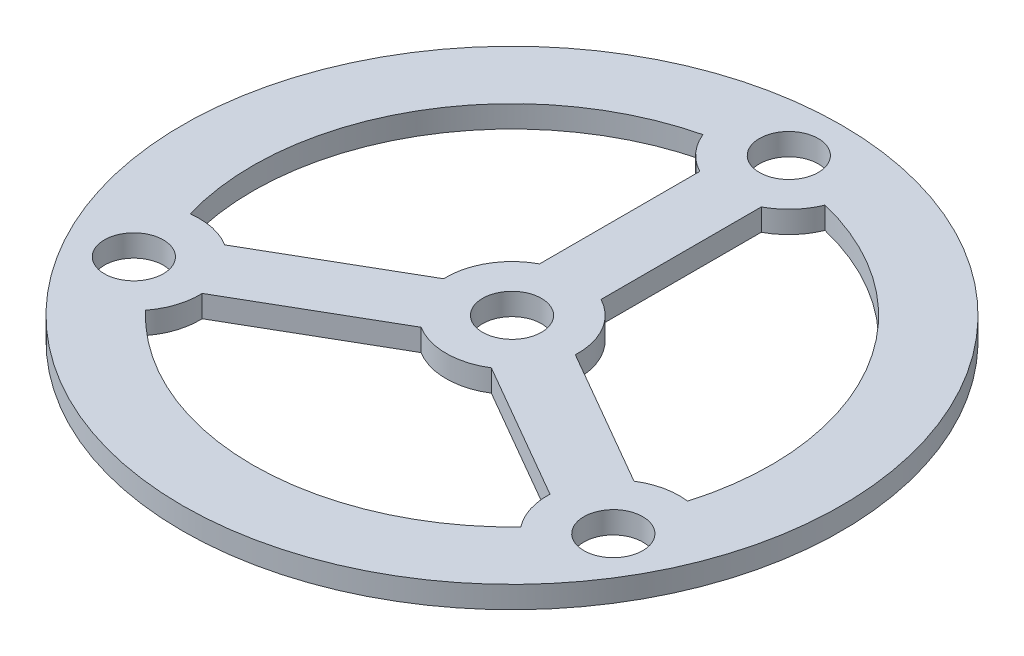
ISO-10303-21;
HEADER;
FILE_DESCRIPTION(('STEP AP214'),'2;1');
FILE_NAME('part.step','',(''),(''),'','','');
FILE_SCHEMA(('AUTOMOTIVE_DESIGN { 1 0 10303 214 1 1 1 1 }'));
ENDSEC;
DATA;
#1=APPLICATION_CONTEXT('core data for automotive mechanical design processes');
#2=APPLICATION_PROTOCOL_DEFINITION('international standard','automotive_design',2000,#1);
#3=PRODUCT_CONTEXT('',#1,'mechanical');
#4=PRODUCT('Part','Part','',(#3));
#5=PRODUCT_RELATED_PRODUCT_CATEGORY('part','',(#4));
#6=PRODUCT_DEFINITION_FORMATION('','',#4);
#7=PRODUCT_DEFINITION_CONTEXT('part definition',#1,'design');
#8=PRODUCT_DEFINITION('design','',#6,#7);
#9=PRODUCT_DEFINITION_SHAPE('','',#8);
#10=(LENGTH_UNIT() NAMED_UNIT(*) SI_UNIT(.MILLI.,.METRE.));
#11=(NAMED_UNIT(*) PLANE_ANGLE_UNIT() SI_UNIT($,.RADIAN.));
#12=(NAMED_UNIT(*) SI_UNIT($,.STERADIAN.) SOLID_ANGLE_UNIT());
#13=UNCERTAINTY_MEASURE_WITH_UNIT(LENGTH_MEASURE(1.E-05),#10,'distance_accuracy_value','');
#14=(GEOMETRIC_REPRESENTATION_CONTEXT(3) GLOBAL_UNCERTAINTY_ASSIGNED_CONTEXT((#13)) GLOBAL_UNIT_ASSIGNED_CONTEXT((#10,
#11,#12)) REPRESENTATION_CONTEXT('',''));
#15=CARTESIAN_POINT('',(0.,0.,0.));
#16=DIRECTION('',(0.,0.,1.));
#17=DIRECTION('',(1.,0.,0.));
#18=AXIS2_PLACEMENT_3D('',#15,#16,#17);
#19=CARTESIAN_POINT('',(0.,2.5,-31.5));
#20=DIRECTION('',(0.,-1.,0.));
#21=DIRECTION('',(0.,0.,-1.));
#22=AXIS2_PLACEMENT_3D('',#19,#20,#21);
#23=CYLINDRICAL_SURFACE('',#22,7.5);
#24=CARTESIAN_POINT('',(0.,2.5,-31.5));
#25=DIRECTION('',(0.,-1.,0.));
#26=DIRECTION('',(0.,0.,1.));
#27=AXIS2_PLACEMENT_3D('',#24,#25,#26);
#28=CIRCLE('',#27,7.5);
#29=CARTESIAN_POINT('',(6.94583999582984,2.5,-28.6706349206349));
#30=VERTEX_POINT('',#29);
#31=CARTESIAN_POINT('',(3.49999999999925,2.5,-24.8667504192888));
#32=VERTEX_POINT('',#31);
#33=EDGE_CURVE('E250',#30,#32,#28,.T.);
#34=ORIENTED_EDGE('',*,*,#33,.T.);
#35=DIRECTION('',(0.,-1.,0.));
#36=VECTOR('',#35,1.);
#37=CARTESIAN_POINT('',(3.49999999999925,2.5,-24.8667504192888));
#38=LINE('',#37,#36);
#39=CARTESIAN_POINT('',(3.49999999999925,0.,-24.8667504192888));
#40=VERTEX_POINT('',#39);
#41=EDGE_CURVE('E11',#32,#40,#38,.T.);
#42=ORIENTED_EDGE('',*,*,#41,.T.);
#43=CARTESIAN_POINT('',(0.,0.,-31.5));
#44=DIRECTION('',(0.,-1.,0.));
#45=DIRECTION('',(0.,0.,1.));
#46=AXIS2_PLACEMENT_3D('',#43,#44,#45);
#47=CIRCLE('',#46,7.5);
#48=CARTESIAN_POINT('',(6.94583999582984,0.,-28.6706349206349));
#49=VERTEX_POINT('',#48);
#50=EDGE_CURVE('E268',#49,#40,#47,.T.);
#51=ORIENTED_EDGE('',*,*,#50,.F.);
#52=DIRECTION('',(0.,-1.,0.));
#53=VECTOR('',#52,1.);
#54=CARTESIAN_POINT('',(6.94583999582984,2.5,-28.6706349206349));
#55=LINE('',#54,#53);
#56=EDGE_CURVE('E267',#30,#49,#55,.T.);
#57=ORIENTED_EDGE('',*,*,#56,.F.);
#58=EDGE_LOOP('',(#34,#42,#51,#57));
#59=FACE_BOUND('',#58,.T.);
#60=ADVANCED_FACE('F34',(#59),#23,.T.);
#61=CARTESIAN_POINT('',(-27.2798002192094,2.5,15.7500000000008));
#62=DIRECTION('',(0.,-1.,0.));
#63=DIRECTION('',(0.,0.,-1.));
#64=AXIS2_PLACEMENT_3D('',#61,#62,#63);
#65=CYLINDRICAL_SURFACE('',#64,7.5);
#66=CARTESIAN_POINT('',(-27.2798002192094,2.5,15.7500000000008));
#67=DIRECTION('',(0.,-1.,0.));
#68=DIRECTION('',(0.,0.,1.));
#69=AXIS2_PLACEMENT_3D('',#66,#67,#68);
#70=CIRCLE('',#69,7.5);
#71=CARTESIAN_POINT('',(-28.3024181818138,2.5,8.32004357330761));
#72=VERTEX_POINT('',#71);
#73=CARTESIAN_POINT('',(-23.2852375726714,2.5,9.40228629639981));
#74=VERTEX_POINT('',#73);
#75=EDGE_CURVE('E257',#72,#74,#70,.T.);
#76=ORIENTED_EDGE('',*,*,#75,.T.);
#77=DIRECTION('',(0.,-1.,0.));
#78=VECTOR('',#77,1.);
#79=CARTESIAN_POINT('',(-23.2852375726714,2.5,9.40228629639982));
#80=LINE('',#79,#78);
#81=CARTESIAN_POINT('',(-23.2852375726714,0.,9.40228629639981));
#82=VERTEX_POINT('',#81);
#83=EDGE_CURVE('E316',#74,#82,#80,.T.);
#84=ORIENTED_EDGE('',*,*,#83,.T.);
#85=CARTESIAN_POINT('',(-27.2798002192094,0.,15.7500000000008));
#86=DIRECTION('',(0.,-1.,0.));
#87=DIRECTION('',(0.,0.,1.));
#88=AXIS2_PLACEMENT_3D('',#85,#86,#87);
#89=CIRCLE('',#88,7.5);
#90=CARTESIAN_POINT('',(-28.3024181818138,0.,8.32004357330761));
#91=VERTEX_POINT('',#90);
#92=EDGE_CURVE('E275',#91,#82,#89,.T.);
#93=ORIENTED_EDGE('',*,*,#92,.F.);
#94=DIRECTION('',(0.,-1.,0.));
#95=VECTOR('',#94,1.);
#96=CARTESIAN_POINT('',(-28.3024181818138,2.5,8.32004357330761));
#97=LINE('',#96,#95);
#98=EDGE_CURVE('E298',#72,#91,#97,.T.);
#99=ORIENTED_EDGE('',*,*,#98,.F.);
#100=EDGE_LOOP('',(#76,#84,#93,#99));
#101=FACE_BOUND('',#100,.T.);
#102=ADVANCED_FACE('F337',(#101),#65,.T.);
#103=CARTESIAN_POINT('',(27.2798002192103,2.5,15.7499999999993));
#104=DIRECTION('',(0.,-1.,0.));
#105=DIRECTION('',(0.,0.,-1.));
#106=AXIS2_PLACEMENT_3D('',#103,#104,#105);
#107=CYLINDRICAL_SURFACE('',#106,7.5);
#108=CARTESIAN_POINT('',(27.2798002192103,2.5,15.7499999999993));
#109=DIRECTION('',(0.,-1.,0.));
#110=DIRECTION('',(0.,0.,1.));
#111=AXIS2_PLACEMENT_3D('',#108,#109,#110);
#112=CIRCLE('',#111,7.5);
#113=CARTESIAN_POINT('',(21.3565781859847,2.5,20.3505913473275));
#114=VERTEX_POINT('',#113);
#115=CARTESIAN_POINT('',(19.7852375726722,2.5,15.4644641228896));
#116=VERTEX_POINT('',#115);
#117=EDGE_CURVE('E262',#114,#116,#112,.T.);
#118=ORIENTED_EDGE('',*,*,#117,.T.);
#119=DIRECTION('',(0.,-1.,0.));
#120=VECTOR('',#119,1.);
#121=CARTESIAN_POINT('',(19.7852375726722,2.5,15.4644641228896));
#122=LINE('',#121,#120);
#123=CARTESIAN_POINT('',(19.7852375726722,0.,15.4644641228896));
#124=VERTEX_POINT('',#123);
#125=EDGE_CURVE('E307',#116,#124,#122,.T.);
#126=ORIENTED_EDGE('',*,*,#125,.T.);
#127=CARTESIAN_POINT('',(27.2798002192103,0.,15.7499999999993));
#128=DIRECTION('',(0.,-1.,0.));
#129=DIRECTION('',(0.,0.,1.));
#130=AXIS2_PLACEMENT_3D('',#127,#128,#129);
#131=CIRCLE('',#130,7.5);
#132=CARTESIAN_POINT('',(21.3565781859847,0.,20.3505913473275));
#133=VERTEX_POINT('',#132);
#134=EDGE_CURVE('E282',#133,#124,#131,.T.);
#135=ORIENTED_EDGE('',*,*,#134,.F.);
#136=DIRECTION('',(0.,-1.,0.));
#137=VECTOR('',#136,1.);
#138=CARTESIAN_POINT('',(21.3565781859847,2.5,20.3505913473275));
#139=LINE('',#138,#137);
#140=EDGE_CURVE('E293',#114,#133,#139,.T.);
#141=ORIENTED_EDGE('',*,*,#140,.F.);
#142=EDGE_LOOP('',(#118,#126,#135,#141));
#143=FACE_BOUND('',#142,.T.);
#144=ADVANCED_FACE('F359',(#143),#107,.T.);
#145=CARTESIAN_POINT('',(0.,2.5,0.));
#146=DIRECTION('',(0.,1.,0.));
#147=DIRECTION('',(0.,0.,1.));
#148=AXIS2_PLACEMENT_3D('',#145,#146,#147);
#149=PLANE('',#148);
#150=CARTESIAN_POINT('',(27.2798002192103,2.5,15.7499999999993));
#151=DIRECTION('',(0.,1.,0.));
#152=DIRECTION('',(0.,0.,1.));
#153=AXIS2_PLACEMENT_3D('',#150,#151,#152);
#154=CIRCLE('',#153,3.35000000000095);
#155=CARTESIAN_POINT('',(27.2798002192103,2.5,19.1000000000002));
#156=VERTEX_POINT('',#155);
#157=EDGE_CURVE('E238',#156,#156,#154,.T.);
#158=ORIENTED_EDGE('',*,*,#157,.F.);
#159=EDGE_LOOP('',(#158));
#160=FACE_BOUND('',#159,.T.);
#161=CARTESIAN_POINT('',(23.285237572672,2.5,9.40228629639846));
#162=VERTEX_POINT('',#161);
#163=CARTESIAN_POINT('',(28.3024181818142,2.5,8.32004357330606));
#164=VERTEX_POINT('',#163);
#165=EDGE_CURVE('E188',#162,#164,#112,.T.);
#166=ORIENTED_EDGE('',*,*,#165,.F.);
#167=DIRECTION('',(0.866025403784434,0.,0.500000000000008));
#168=VECTOR('',#167,1.);
#169=CARTESIAN_POINT('',(1.75000000000046,2.5,-3.03108891324628));
#170=LINE('',#169,#168);
#171=CARTESIAN_POINT('',(7.49456264653806,2.5,0.285535877108947));
#172=VERTEX_POINT('',#171);
#173=EDGE_CURVE('E165',#172,#162,#170,.T.);
#174=ORIENTED_EDGE('',*,*,#173,.F.);
#175=CARTESIAN_POINT('',(0.,2.5,0.));
#176=DIRECTION('',(0.,1.,0.));
#177=DIRECTION('',(0.,0.,1.));
#178=AXIS2_PLACEMENT_3D('',#175,#176,#177);
#179=CIRCLE('',#178,7.5);
#180=CARTESIAN_POINT('',(3.49999999999916,2.5,-6.63324958071124));
#181=VERTEX_POINT('',#180);
#182=EDGE_CURVE('E174',#172,#181,#179,.T.);
#183=ORIENTED_EDGE('',*,*,#182,.T.);
#184=DIRECTION('',(0.,0.,-1.));
#185=VECTOR('',#184,1.);
#186=CARTESIAN_POINT('',(3.49999999999913,2.5,0.));
#187=LINE('',#186,#185);
#188=EDGE_CURVE('E180',#181,#32,#187,.T.);
#189=ORIENTED_EDGE('',*,*,#188,.T.);
#190=ORIENTED_EDGE('',*,*,#33,.F.);
#191=CARTESIAN_POINT('',(0.,2.5,0.));
#192=DIRECTION('',(0.,1.,0.));
#193=DIRECTION('',(0.,0.,1.));
#194=AXIS2_PLACEMENT_3D('',#191,#192,#193);
#195=CIRCLE('',#194,29.5);
#196=EDGE_CURVE('E265',#164,#30,#195,.T.);
#197=ORIENTED_EDGE('',*,*,#196,.F.);
#198=EDGE_LOOP('',(#166,#174,#183,#189,#190,#197));
#199=FACE_BOUND('',#198,.T.);
#200=CARTESIAN_POINT('',(0.,2.5,-31.5));
#201=DIRECTION('',(0.,1.,0.));
#202=DIRECTION('',(0.,0.,1.));
#203=AXIS2_PLACEMENT_3D('',#200,#201,#202);
#204=CIRCLE('',#203,3.35);
#205=CARTESIAN_POINT('',(0.,2.5,-28.15));
#206=VERTEX_POINT('',#205);
#207=EDGE_CURVE('E244',#206,#206,#204,.T.);
#208=ORIENTED_EDGE('',*,*,#207,.F.);
#209=EDGE_LOOP('',(#208));
#210=FACE_BOUND('',#209,.T.);
#211=CARTESIAN_POINT('',(-3.50000000000076,2.5,-24.8667504192896));
#212=VERTEX_POINT('',#211);
#213=CARTESIAN_POINT('',(-6.94583999582983,2.5,-28.6706349206349));
#214=VERTEX_POINT('',#213);
#215=EDGE_CURVE('E254',#212,#214,#28,.T.);
#216=ORIENTED_EDGE('',*,*,#215,.F.);
#217=DIRECTION('',(0.,0.,-1.));
#218=VECTOR('',#217,1.);
#219=CARTESIAN_POINT('',(-3.50000000000087,2.5,0.));
#220=LINE('',#219,#218);
#221=CARTESIAN_POINT('',(-3.50000000000084,2.5,-6.63324958071036));
#222=VERTEX_POINT('',#221);
#223=EDGE_CURVE('E196',#222,#212,#220,.T.);
#224=ORIENTED_EDGE('',*,*,#223,.F.);
#225=CARTESIAN_POINT('',(-7.49456264653799,2.5,0.285535877110846));
#226=VERTEX_POINT('',#225);
#227=EDGE_CURVE('E183',#222,#226,#179,.T.);
#228=ORIENTED_EDGE('',*,*,#227,.T.);
#229=DIRECTION('',(-0.866025403784439,0.,0.5));
#230=VECTOR('',#229,1.);
#231=CARTESIAN_POINT('',(-1.74999999999957,2.5,-3.03108891324478));
#232=LINE('',#231,#230);
#233=EDGE_CURVE('E198',#226,#74,#232,.T.);
#234=ORIENTED_EDGE('',*,*,#233,.T.);
#235=ORIENTED_EDGE('',*,*,#75,.F.);
#236=CARTESIAN_POINT('',(0.,2.5,0.));
#237=DIRECTION('',(0.,1.,0.));
#238=DIRECTION('',(0.,0.,1.));
#239=AXIS2_PLACEMENT_3D('',#236,#237,#238);
#240=CIRCLE('',#239,29.5);
#241=EDGE_CURVE('E253',#214,#72,#240,.T.);
#242=ORIENTED_EDGE('',*,*,#241,.F.);
#243=EDGE_LOOP('',(#216,#224,#228,#234,#235,#242));
#244=FACE_BOUND('',#243,.T.);
#245=CARTESIAN_POINT('',(-27.2798002192094,2.5,15.7500000000008));
#246=DIRECTION('',(0.,1.,0.));
#247=DIRECTION('',(0.,0.,1.));
#248=AXIS2_PLACEMENT_3D('',#245,#246,#247);
#249=CIRCLE('',#248,3.35000000000111);
#250=CARTESIAN_POINT('',(-27.2798002192094,2.5,19.1000000000019));
#251=VERTEX_POINT('',#250);
#252=EDGE_CURVE('E232',#251,#251,#249,.T.);
#253=ORIENTED_EDGE('',*,*,#252,.F.);
#254=EDGE_LOOP('',(#253));
#255=FACE_BOUND('',#254,.T.);
#256=CARTESIAN_POINT('',(-19.7852375726714,2.5,15.4644641228909));
#257=VERTEX_POINT('',#256);
#258=CARTESIAN_POINT('',(-21.3565781859836,2.5,20.3505913473287));
#259=VERTEX_POINT('',#258);
#260=EDGE_CURVE('E256',#257,#259,#70,.T.);
#261=ORIENTED_EDGE('',*,*,#260,.F.);
#262=DIRECTION('',(-0.866025403784439,0.,0.5));
#263=VECTOR('',#262,1.);
#264=CARTESIAN_POINT('',(1.75000000000044,2.5,3.03108891324629));
#265=LINE('',#264,#263);
#266=CARTESIAN_POINT('',(-3.99456264653719,2.5,6.34771370360146));
#267=VERTEX_POINT('',#266);
#268=EDGE_CURVE('E201',#267,#257,#265,.T.);
#269=ORIENTED_EDGE('',*,*,#268,.F.);
#270=CARTESIAN_POINT('',(3.9945626465388,2.5,6.34771370360045));
#271=VERTEX_POINT('',#270);
#272=EDGE_CURVE('E182',#267,#271,#179,.T.);
#273=ORIENTED_EDGE('',*,*,#272,.T.);
#274=DIRECTION('',(0.866025403784434,0.,0.500000000000008));
#275=VECTOR('',#274,1.);
#276=CARTESIAN_POINT('',(-1.74999999999959,2.5,3.03108891324476));
#277=LINE('',#276,#275);
#278=EDGE_CURVE('E203',#271,#116,#277,.T.);
#279=ORIENTED_EDGE('',*,*,#278,.T.);
#280=ORIENTED_EDGE('',*,*,#117,.F.);
#281=CARTESIAN_POINT('',(0.,2.5,0.));
#282=DIRECTION('',(0.,1.,0.));
#283=DIRECTION('',(0.,0.,1.));
#284=AXIS2_PLACEMENT_3D('',#281,#282,#283);
#285=CIRCLE('',#284,29.5);
#286=EDGE_CURVE('E260',#259,#114,#285,.T.);
#287=ORIENTED_EDGE('',*,*,#286,.F.);
#288=EDGE_LOOP('',(#261,#269,#273,#279,#280,#287));
#289=FACE_BOUND('',#288,.T.);
#290=CARTESIAN_POINT('',(0.,2.5,0.));
#291=DIRECTION('',(0.,1.,0.));
#292=DIRECTION('',(0.,0.,1.));
#293=AXIS2_PLACEMENT_3D('',#290,#291,#292);
#294=CIRCLE('',#293,3.35);
#295=CARTESIAN_POINT('',(0.,2.5,3.35));
#296=VERTEX_POINT('',#295);
#297=EDGE_CURVE('E206',#296,#296,#294,.T.);
#298=ORIENTED_EDGE('',*,*,#297,.F.);
#299=EDGE_LOOP('',(#298));
#300=FACE_BOUND('',#299,.T.);
#301=CARTESIAN_POINT('',(0.,2.5,0.));
#302=DIRECTION('',(0.,1.,0.));
#303=DIRECTION('',(0.,0.,1.));
#304=AXIS2_PLACEMENT_3D('',#301,#302,#303);
#305=CIRCLE('',#304,37.5);
#306=CARTESIAN_POINT('',(0.,2.5,37.5));
#307=VERTEX_POINT('',#306);
#308=EDGE_CURVE('E304',#307,#307,#305,.T.);
#309=ORIENTED_EDGE('',*,*,#308,.T.);
#310=EDGE_LOOP('',(#309));
#311=FACE_BOUND('',#310,.T.);
#312=ADVANCED_FACE('F185',(#160,#199,#210,#244,#255,#289,#300,#311),#149,.T.);
#313=CARTESIAN_POINT('',(0.,0.,0.));
#314=DIRECTION('',(0.,1.,0.));
#315=DIRECTION('',(0.,0.,1.));
#316=AXIS2_PLACEMENT_3D('',#313,#314,#315);
#317=PLANE('',#316);
#318=CARTESIAN_POINT('',(27.2798002192103,0.,15.7499999999993));
#319=DIRECTION('',(0.,1.,0.));
#320=DIRECTION('',(0.,0.,1.));
#321=AXIS2_PLACEMENT_3D('',#318,#319,#320);
#322=CIRCLE('',#321,3.35000000000095);
#323=CARTESIAN_POINT('',(27.2798002192103,0.,19.1000000000002));
#324=VERTEX_POINT('',#323);
#325=EDGE_CURVE('E235',#324,#324,#322,.T.);
#326=ORIENTED_EDGE('',*,*,#325,.T.);
#327=EDGE_LOOP('',(#326));
#328=FACE_BOUND('',#327,.T.);
#329=DIRECTION('',(0.866025403784434,0.,0.500000000000008));
#330=VECTOR('',#329,1.);
#331=CARTESIAN_POINT('',(1.75000000000046,0.,-3.03108891324628));
#332=LINE('',#331,#330);
#333=CARTESIAN_POINT('',(7.49456264653806,0.,0.285535877108947));
#334=VERTEX_POINT('',#333);
#335=CARTESIAN_POINT('',(23.285237572672,0.,9.40228629639846));
#336=VERTEX_POINT('',#335);
#337=EDGE_CURVE('E167',#334,#336,#332,.T.);
#338=ORIENTED_EDGE('',*,*,#337,.T.);
#339=CARTESIAN_POINT('',(28.3024181818142,0.,8.32004357330607));
#340=VERTEX_POINT('',#339);
#341=EDGE_CURVE('E281',#336,#340,#131,.T.);
#342=ORIENTED_EDGE('',*,*,#341,.T.);
#343=CARTESIAN_POINT('',(0.,0.,0.));
#344=DIRECTION('',(0.,1.,0.));
#345=DIRECTION('',(0.,0.,1.));
#346=AXIS2_PLACEMENT_3D('',#343,#344,#345);
#347=CIRCLE('',#346,29.5);
#348=EDGE_CURVE('E285',#340,#49,#347,.T.);
#349=ORIENTED_EDGE('',*,*,#348,.T.);
#350=ORIENTED_EDGE('',*,*,#50,.T.);
#351=DIRECTION('',(0.,0.,-1.));
#352=VECTOR('',#351,1.);
#353=CARTESIAN_POINT('',(3.49999999999913,0.,0.));
#354=LINE('',#353,#352);
#355=CARTESIAN_POINT('',(3.49999999999916,0.,-6.63324958071124));
#356=VERTEX_POINT('',#355);
#357=EDGE_CURVE('E213',#356,#40,#354,.T.);
#358=ORIENTED_EDGE('',*,*,#357,.F.);
#359=CARTESIAN_POINT('',(0.,0.,0.));
#360=DIRECTION('',(0.,1.,0.));
#361=DIRECTION('',(0.,0.,1.));
#362=AXIS2_PLACEMENT_3D('',#359,#360,#361);
#363=CIRCLE('',#362,7.5);
#364=EDGE_CURVE('E211',#334,#356,#363,.T.);
#365=ORIENTED_EDGE('',*,*,#364,.F.);
#366=EDGE_LOOP('',(#338,#342,#349,#350,#358,#365));
#367=FACE_BOUND('',#366,.T.);
#368=CARTESIAN_POINT('',(0.,0.,-31.5));
#369=DIRECTION('',(0.,1.,0.));
#370=DIRECTION('',(0.,0.,1.));
#371=AXIS2_PLACEMENT_3D('',#368,#369,#370);
#372=CIRCLE('',#371,3.35);
#373=CARTESIAN_POINT('',(0.,0.,-28.15));
#374=VERTEX_POINT('',#373);
#375=EDGE_CURVE('E241',#374,#374,#372,.T.);
#376=ORIENTED_EDGE('',*,*,#375,.T.);
#377=EDGE_LOOP('',(#376));
#378=FACE_BOUND('',#377,.T.);
#379=DIRECTION('',(0.,0.,-1.));
#380=VECTOR('',#379,1.);
#381=CARTESIAN_POINT('',(-3.50000000000087,0.,0.));
#382=LINE('',#381,#380);
#383=CARTESIAN_POINT('',(-3.50000000000084,0.,-6.63324958071036));
#384=VERTEX_POINT('',#383);
#385=CARTESIAN_POINT('',(-3.50000000000076,0.,-24.8667504192896));
#386=VERTEX_POINT('',#385);
#387=EDGE_CURVE('E49',#384,#386,#382,.T.);
#388=ORIENTED_EDGE('',*,*,#387,.T.);
#389=CARTESIAN_POINT('',(-6.94583999582983,0.,-28.6706349206349));
#390=VERTEX_POINT('',#389);
#391=EDGE_CURVE('E247',#386,#390,#47,.T.);
#392=ORIENTED_EDGE('',*,*,#391,.T.);
#393=CARTESIAN_POINT('',(0.,0.,0.));
#394=DIRECTION('',(0.,1.,0.));
#395=DIRECTION('',(0.,0.,1.));
#396=AXIS2_PLACEMENT_3D('',#393,#394,#395);
#397=CIRCLE('',#396,29.5);
#398=EDGE_CURVE('E271',#390,#91,#397,.T.);
#399=ORIENTED_EDGE('',*,*,#398,.T.);
#400=ORIENTED_EDGE('',*,*,#92,.T.);
#401=DIRECTION('',(-0.866025403784439,0.,0.5));
#402=VECTOR('',#401,1.);
#403=CARTESIAN_POINT('',(-1.74999999999957,0.,-3.03108891324478));
#404=LINE('',#403,#402);
#405=CARTESIAN_POINT('',(-7.49456264653799,0.,0.285535877110846));
#406=VERTEX_POINT('',#405);
#407=EDGE_CURVE('E218',#406,#82,#404,.T.);
#408=ORIENTED_EDGE('',*,*,#407,.F.);
#409=EDGE_CURVE('E215',#384,#406,#363,.T.);
#410=ORIENTED_EDGE('',*,*,#409,.F.);
#411=EDGE_LOOP('',(#388,#392,#399,#400,#408,#410));
#412=FACE_BOUND('',#411,.T.);
#413=CARTESIAN_POINT('',(-27.2798002192094,0.,15.7500000000008));
#414=DIRECTION('',(0.,1.,0.));
#415=DIRECTION('',(0.,0.,1.));
#416=AXIS2_PLACEMENT_3D('',#413,#414,#415);
#417=CIRCLE('',#416,3.35000000000111);
#418=CARTESIAN_POINT('',(-27.2798002192094,0.,19.1000000000019));
#419=VERTEX_POINT('',#418);
#420=EDGE_CURVE('E170',#419,#419,#417,.T.);
#421=ORIENTED_EDGE('',*,*,#420,.T.);
#422=EDGE_LOOP('',(#421));
#423=FACE_BOUND('',#422,.T.);
#424=DIRECTION('',(-0.866025403784439,0.,0.5));
#425=VECTOR('',#424,1.);
#426=CARTESIAN_POINT('',(1.75000000000044,0.,3.03108891324629));
#427=LINE('',#426,#425);
#428=CARTESIAN_POINT('',(-3.99456264653719,0.,6.34771370360146));
#429=VERTEX_POINT('',#428);
#430=CARTESIAN_POINT('',(-19.7852375726714,0.,15.4644641228909));
#431=VERTEX_POINT('',#430);
#432=EDGE_CURVE('E57',#429,#431,#427,.T.);
#433=ORIENTED_EDGE('',*,*,#432,.T.);
#434=CARTESIAN_POINT('',(-21.3565781859836,0.,20.3505913473287));
#435=VERTEX_POINT('',#434);
#436=EDGE_CURVE('E274',#431,#435,#89,.T.);
#437=ORIENTED_EDGE('',*,*,#436,.T.);
#438=CARTESIAN_POINT('',(0.,0.,0.));
#439=DIRECTION('',(0.,1.,0.));
#440=DIRECTION('',(0.,0.,1.));
#441=AXIS2_PLACEMENT_3D('',#438,#439,#440);
#442=CIRCLE('',#441,29.5);
#443=EDGE_CURVE('E278',#435,#133,#442,.T.);
#444=ORIENTED_EDGE('',*,*,#443,.T.);
#445=ORIENTED_EDGE('',*,*,#134,.T.);
#446=DIRECTION('',(0.866025403784434,0.,0.500000000000008));
#447=VECTOR('',#446,1.);
#448=CARTESIAN_POINT('',(-1.74999999999959,0.,3.03108891324476));
#449=LINE('',#448,#447);
#450=CARTESIAN_POINT('',(3.9945626465388,0.,6.34771370360045));
#451=VERTEX_POINT('',#450);
#452=EDGE_CURVE('E192',#451,#124,#449,.T.);
#453=ORIENTED_EDGE('',*,*,#452,.F.);
#454=EDGE_CURVE('E214',#429,#451,#363,.T.);
#455=ORIENTED_EDGE('',*,*,#454,.F.);
#456=EDGE_LOOP('',(#433,#437,#444,#445,#453,#455));
#457=FACE_BOUND('',#456,.T.);
#458=CARTESIAN_POINT('',(0.,0.,0.));
#459=DIRECTION('',(0.,1.,0.));
#460=DIRECTION('',(0.,0.,1.));
#461=AXIS2_PLACEMENT_3D('',#458,#459,#460);
#462=CIRCLE('',#461,3.35);
#463=CARTESIAN_POINT('',(0.,0.,3.35));
#464=VERTEX_POINT('',#463);
#465=EDGE_CURVE('E189',#464,#464,#462,.T.);
#466=ORIENTED_EDGE('',*,*,#465,.T.);
#467=EDGE_LOOP('',(#466));
#468=FACE_BOUND('',#467,.T.);
#469=CARTESIAN_POINT('',(0.,0.,0.));
#470=DIRECTION('',(0.,1.,0.));
#471=DIRECTION('',(0.,0.,1.));
#472=AXIS2_PLACEMENT_3D('',#469,#470,#471);
#473=CIRCLE('',#472,37.5);
#474=CARTESIAN_POINT('',(0.,0.,37.5));
#475=VERTEX_POINT('',#474);
#476=EDGE_CURVE('E303',#475,#475,#473,.T.);
#477=ORIENTED_EDGE('',*,*,#476,.F.);
#478=EDGE_LOOP('',(#477));
#479=FACE_BOUND('',#478,.T.);
#480=ADVANCED_FACE('F328',(#328,#367,#378,#412,#423,#457,#468,#479),#317,.F.);
#481=CARTESIAN_POINT('',(0.,2.5,0.));
#482=DIRECTION('',(0.,-1.,0.));
#483=DIRECTION('',(0.,0.,-1.));
#484=AXIS2_PLACEMENT_3D('',#481,#482,#483);
#485=CYLINDRICAL_SURFACE('',#484,37.5);
#486=ORIENTED_EDGE('',*,*,#308,.F.);
#487=EDGE_LOOP('',(#486));
#488=FACE_BOUND('',#487,.T.);
#489=ORIENTED_EDGE('',*,*,#476,.T.);
#490=EDGE_LOOP('',(#489));
#491=FACE_BOUND('',#490,.T.);
#492=ADVANCED_FACE('F36',(#488,#491),#485,.T.);
#493=DIRECTION('',(0.,-1.,0.));
#494=VECTOR('',#493,1.);
#495=CARTESIAN_POINT('',(-3.50000000000076,2.5,-24.8667504192896));
#496=LINE('',#495,#494);
#497=EDGE_CURVE('E42',#212,#386,#496,.T.);
#498=ORIENTED_EDGE('',*,*,#497,.F.);
#499=ORIENTED_EDGE('',*,*,#215,.T.);
#500=DIRECTION('',(0.,-1.,0.));
#501=VECTOR('',#500,1.);
#502=CARTESIAN_POINT('',(-6.94583999582983,2.5,-28.6706349206349));
#503=LINE('',#502,#501);
#504=EDGE_CURVE('E300',#214,#390,#503,.T.);
#505=ORIENTED_EDGE('',*,*,#504,.T.);
#506=ORIENTED_EDGE('',*,*,#391,.F.);
#507=EDGE_LOOP('',(#498,#499,#505,#506));
#508=FACE_BOUND('',#507,.T.);
#509=ADVANCED_FACE('F325',(#508),#23,.T.);
#510=CARTESIAN_POINT('',(0.,2.5,0.));
#511=DIRECTION('',(0.,-1.,0.));
#512=DIRECTION('',(0.,0.,-1.));
#513=AXIS2_PLACEMENT_3D('',#510,#511,#512);
#514=CYLINDRICAL_SURFACE('',#513,29.5);
#515=ORIENTED_EDGE('',*,*,#398,.F.);
#516=ORIENTED_EDGE('',*,*,#504,.F.);
#517=ORIENTED_EDGE('',*,*,#241,.T.);
#518=ORIENTED_EDGE('',*,*,#98,.T.);
#519=EDGE_LOOP('',(#515,#516,#517,#518));
#520=FACE_BOUND('',#519,.T.);
#521=ADVANCED_FACE('F331',(#520),#514,.F.);
#522=DIRECTION('',(0.,-1.,0.));
#523=VECTOR('',#522,1.);
#524=CARTESIAN_POINT('',(-19.7852375726714,2.5,15.4644641228909));
#525=LINE('',#524,#523);
#526=EDGE_CURVE('E314',#257,#431,#525,.T.);
#527=ORIENTED_EDGE('',*,*,#526,.F.);
#528=ORIENTED_EDGE('',*,*,#260,.T.);
#529=DIRECTION('',(0.,-1.,0.));
#530=VECTOR('',#529,1.);
#531=CARTESIAN_POINT('',(-21.3565781859836,2.5,20.3505913473287));
#532=LINE('',#531,#530);
#533=EDGE_CURVE('E295',#259,#435,#532,.T.);
#534=ORIENTED_EDGE('',*,*,#533,.T.);
#535=ORIENTED_EDGE('',*,*,#436,.F.);
#536=EDGE_LOOP('',(#527,#528,#534,#535));
#537=FACE_BOUND('',#536,.T.);
#538=ADVANCED_FACE('F393',(#537),#65,.T.);
#539=CARTESIAN_POINT('',(0.,2.5,0.));
#540=DIRECTION('',(0.,-1.,0.));
#541=DIRECTION('',(0.,0.,-1.));
#542=AXIS2_PLACEMENT_3D('',#539,#540,#541);
#543=CYLINDRICAL_SURFACE('',#542,29.5);
#544=ORIENTED_EDGE('',*,*,#443,.F.);
#545=ORIENTED_EDGE('',*,*,#533,.F.);
#546=ORIENTED_EDGE('',*,*,#286,.T.);
#547=ORIENTED_EDGE('',*,*,#140,.T.);
#548=EDGE_LOOP('',(#544,#545,#546,#547));
#549=FACE_BOUND('',#548,.T.);
#550=ADVANCED_FACE('F402',(#549),#543,.F.);
#551=DIRECTION('',(0.,-1.,0.));
#552=VECTOR('',#551,1.);
#553=CARTESIAN_POINT('',(23.285237572672,2.5,9.40228629639846));
#554=LINE('',#553,#552);
#555=EDGE_CURVE('E312',#162,#336,#554,.T.);
#556=ORIENTED_EDGE('',*,*,#555,.F.);
#557=ORIENTED_EDGE('',*,*,#165,.T.);
#558=DIRECTION('',(0.,-1.,0.));
#559=VECTOR('',#558,1.);
#560=CARTESIAN_POINT('',(28.3024181818142,2.5,8.32004357330607));
#561=LINE('',#560,#559);
#562=EDGE_CURVE('E290',#164,#340,#561,.T.);
#563=ORIENTED_EDGE('',*,*,#562,.T.);
#564=ORIENTED_EDGE('',*,*,#341,.F.);
#565=EDGE_LOOP('',(#556,#557,#563,#564));
#566=FACE_BOUND('',#565,.T.);
#567=ADVANCED_FACE('F407',(#566),#107,.T.);
#568=CARTESIAN_POINT('',(0.,2.5,0.));
#569=DIRECTION('',(0.,-1.,0.));
#570=DIRECTION('',(0.,0.,-1.));
#571=AXIS2_PLACEMENT_3D('',#568,#569,#570);
#572=CYLINDRICAL_SURFACE('',#571,29.5);
#573=ORIENTED_EDGE('',*,*,#348,.F.);
#574=ORIENTED_EDGE('',*,*,#562,.F.);
#575=ORIENTED_EDGE('',*,*,#196,.T.);
#576=ORIENTED_EDGE('',*,*,#56,.T.);
#577=EDGE_LOOP('',(#573,#574,#575,#576));
#578=FACE_BOUND('',#577,.T.);
#579=ADVANCED_FACE('F411',(#578),#572,.F.);
#580=CARTESIAN_POINT('',(0.,2.5,-31.5));
#581=DIRECTION('',(0.,-1.,0.));
#582=DIRECTION('',(0.,0.,-1.));
#583=AXIS2_PLACEMENT_3D('',#580,#581,#582);
#584=CYLINDRICAL_SURFACE('',#583,3.35);
#585=ORIENTED_EDGE('',*,*,#207,.T.);
#586=EDGE_LOOP('',(#585));
#587=FACE_BOUND('',#586,.T.);
#588=ORIENTED_EDGE('',*,*,#375,.F.);
#589=EDGE_LOOP('',(#588));
#590=FACE_BOUND('',#589,.T.);
#591=ADVANCED_FACE('F415',(#587,#590),#584,.F.);
#592=CARTESIAN_POINT('',(27.2798002192103,2.5,15.7499999999993));
#593=DIRECTION('',(0.,-1.,0.));
#594=DIRECTION('',(0.,0.,-1.));
#595=AXIS2_PLACEMENT_3D('',#592,#593,#594);
#596=CYLINDRICAL_SURFACE('',#595,3.35000000000095);
#597=ORIENTED_EDGE('',*,*,#325,.F.);
#598=EDGE_LOOP('',(#597));
#599=FACE_BOUND('',#598,.T.);
#600=ORIENTED_EDGE('',*,*,#157,.T.);
#601=EDGE_LOOP('',(#600));
#602=FACE_BOUND('',#601,.T.);
#603=ADVANCED_FACE('F376',(#599,#602),#596,.F.);
#604=CARTESIAN_POINT('',(-27.2798002192094,2.5,15.7500000000008));
#605=DIRECTION('',(0.,-1.,0.));
#606=DIRECTION('',(0.,0.,-1.));
#607=AXIS2_PLACEMENT_3D('',#604,#605,#606);
#608=CYLINDRICAL_SURFACE('',#607,3.35000000000111);
#609=ORIENTED_EDGE('',*,*,#252,.T.);
#610=EDGE_LOOP('',(#609));
#611=FACE_BOUND('',#610,.T.);
#612=ORIENTED_EDGE('',*,*,#420,.F.);
#613=EDGE_LOOP('',(#612));
#614=FACE_BOUND('',#613,.T.);
#615=ADVANCED_FACE('F373',(#611,#614),#608,.F.);
#616=CARTESIAN_POINT('',(1.75000000000046,2.5,-3.03108891324628));
#617=DIRECTION('',(0.500000000000008,0.,-0.866025403784434));
#618=DIRECTION('',(-0.866025403784434,0.,-0.500000000000008));
#619=AXIS2_PLACEMENT_3D('',#616,#617,#618);
#620=PLANE('',#619);
#621=ORIENTED_EDGE('',*,*,#173,.T.);
#622=ORIENTED_EDGE('',*,*,#555,.T.);
#623=ORIENTED_EDGE('',*,*,#337,.F.);
#624=DIRECTION('',(0.,-1.,0.));
#625=VECTOR('',#624,1.);
#626=CARTESIAN_POINT('',(7.49456264653806,2.5,0.285535877108947));
#627=LINE('',#626,#625);
#628=EDGE_CURVE('E160',#172,#334,#627,.T.);
#629=ORIENTED_EDGE('',*,*,#628,.F.);
#630=EDGE_LOOP('',(#621,#622,#623,#629));
#631=FACE_BOUND('',#630,.T.);
#632=ADVANCED_FACE('F162',(#631),#620,.T.);
#633=CARTESIAN_POINT('',(0.,2.5,0.));
#634=DIRECTION('',(0.,-1.,0.));
#635=DIRECTION('',(0.,0.,-1.));
#636=AXIS2_PLACEMENT_3D('',#633,#634,#635);
#637=CYLINDRICAL_SURFACE('',#636,7.5);
#638=ORIENTED_EDGE('',*,*,#364,.T.);
#639=DIRECTION('',(0.,-1.,0.));
#640=VECTOR('',#639,1.);
#641=CARTESIAN_POINT('',(3.49999999999916,2.5,-6.63324958071124));
#642=LINE('',#641,#640);
#643=EDGE_CURVE('E171',#181,#356,#642,.T.);
#644=ORIENTED_EDGE('',*,*,#643,.F.);
#645=ORIENTED_EDGE('',*,*,#182,.F.);
#646=ORIENTED_EDGE('',*,*,#628,.T.);
#647=EDGE_LOOP('',(#638,#644,#645,#646));
#648=FACE_BOUND('',#647,.T.);
#649=ADVANCED_FACE('F175',(#648),#637,.T.);
#650=CARTESIAN_POINT('',(3.49999999999913,2.5,0.));
#651=DIRECTION('',(-1.,0.,0.));
#652=DIRECTION('',(0.,0.,1.));
#653=AXIS2_PLACEMENT_3D('',#650,#651,#652);
#654=PLANE('',#653);
#655=ORIENTED_EDGE('',*,*,#41,.F.);
#656=ORIENTED_EDGE('',*,*,#188,.F.);
#657=ORIENTED_EDGE('',*,*,#643,.T.);
#658=ORIENTED_EDGE('',*,*,#357,.T.);
#659=EDGE_LOOP('',(#655,#656,#657,#658));
#660=FACE_BOUND('',#659,.T.);
#661=ADVANCED_FACE('F425',(#660),#654,.F.);
#662=CARTESIAN_POINT('',(-3.50000000000087,2.5,0.));
#663=DIRECTION('',(-1.,0.,0.));
#664=DIRECTION('',(0.,0.,1.));
#665=AXIS2_PLACEMENT_3D('',#662,#663,#664);
#666=PLANE('',#665);
#667=ORIENTED_EDGE('',*,*,#223,.T.);
#668=ORIENTED_EDGE('',*,*,#497,.T.);
#669=ORIENTED_EDGE('',*,*,#387,.F.);
#670=DIRECTION('',(0.,-1.,0.));
#671=VECTOR('',#670,1.);
#672=CARTESIAN_POINT('',(-3.50000000000084,2.5,-6.63324958071036));
#673=LINE('',#672,#671);
#674=EDGE_CURVE('E229',#222,#384,#673,.T.);
#675=ORIENTED_EDGE('',*,*,#674,.F.);
#676=EDGE_LOOP('',(#667,#668,#669,#675));
#677=FACE_BOUND('',#676,.T.);
#678=ADVANCED_FACE('F321',(#677),#666,.T.);
#679=ORIENTED_EDGE('',*,*,#409,.T.);
#680=DIRECTION('',(0.,-1.,0.));
#681=VECTOR('',#680,1.);
#682=CARTESIAN_POINT('',(-7.49456264653799,2.5,0.285535877110846));
#683=LINE('',#682,#681);
#684=EDGE_CURVE('E226',#226,#406,#683,.T.);
#685=ORIENTED_EDGE('',*,*,#684,.F.);
#686=ORIENTED_EDGE('',*,*,#227,.F.);
#687=ORIENTED_EDGE('',*,*,#674,.T.);
#688=EDGE_LOOP('',(#679,#685,#686,#687));
#689=FACE_BOUND('',#688,.T.);
#690=ADVANCED_FACE('F345',(#689),#637,.T.);
#691=CARTESIAN_POINT('',(-1.74999999999957,2.5,-3.03108891324478));
#692=DIRECTION('',(0.5,0.,0.866025403784439));
#693=DIRECTION('',(0.866025403784439,0.,-0.5));
#694=AXIS2_PLACEMENT_3D('',#691,#692,#693);
#695=PLANE('',#694);
#696=ORIENTED_EDGE('',*,*,#83,.F.);
#697=ORIENTED_EDGE('',*,*,#233,.F.);
#698=ORIENTED_EDGE('',*,*,#684,.T.);
#699=ORIENTED_EDGE('',*,*,#407,.T.);
#700=EDGE_LOOP('',(#696,#697,#698,#699));
#701=FACE_BOUND('',#700,.T.);
#702=ADVANCED_FACE('F340',(#701),#695,.F.);
#703=CARTESIAN_POINT('',(1.75000000000044,2.5,3.03108891324629));
#704=DIRECTION('',(0.5,0.,0.866025403784439));
#705=DIRECTION('',(0.866025403784439,0.,-0.5));
#706=AXIS2_PLACEMENT_3D('',#703,#704,#705);
#707=PLANE('',#706);
#708=ORIENTED_EDGE('',*,*,#268,.T.);
#709=ORIENTED_EDGE('',*,*,#526,.T.);
#710=ORIENTED_EDGE('',*,*,#432,.F.);
#711=DIRECTION('',(0.,-1.,0.));
#712=VECTOR('',#711,1.);
#713=CARTESIAN_POINT('',(-3.99456264653719,2.5,6.34771370360146));
#714=LINE('',#713,#712);
#715=EDGE_CURVE('E224',#267,#429,#714,.T.);
#716=ORIENTED_EDGE('',*,*,#715,.F.);
#717=EDGE_LOOP('',(#708,#709,#710,#716));
#718=FACE_BOUND('',#717,.T.);
#719=ADVANCED_FACE('F433',(#718),#707,.T.);
#720=ORIENTED_EDGE('',*,*,#454,.T.);
#721=DIRECTION('',(0.,-1.,0.));
#722=VECTOR('',#721,1.);
#723=CARTESIAN_POINT('',(3.9945626465388,2.5,6.34771370360045));
#724=LINE('',#723,#722);
#725=EDGE_CURVE('E209',#271,#451,#724,.T.);
#726=ORIENTED_EDGE('',*,*,#725,.F.);
#727=ORIENTED_EDGE('',*,*,#272,.F.);
#728=ORIENTED_EDGE('',*,*,#715,.T.);
#729=EDGE_LOOP('',(#720,#726,#727,#728));
#730=FACE_BOUND('',#729,.T.);
#731=ADVANCED_FACE('F348',(#730),#637,.T.);
#732=CARTESIAN_POINT('',(-1.74999999999959,2.5,3.03108891324476));
#733=DIRECTION('',(0.500000000000008,0.,-0.866025403784434));
#734=DIRECTION('',(-0.866025403784434,0.,-0.500000000000008));
#735=AXIS2_PLACEMENT_3D('',#732,#733,#734);
#736=PLANE('',#735);
#737=ORIENTED_EDGE('',*,*,#125,.F.);
#738=ORIENTED_EDGE('',*,*,#278,.F.);
#739=ORIENTED_EDGE('',*,*,#725,.T.);
#740=ORIENTED_EDGE('',*,*,#452,.T.);
#741=EDGE_LOOP('',(#737,#738,#739,#740));
#742=FACE_BOUND('',#741,.T.);
#743=ADVANCED_FACE('F353',(#742),#736,.F.);
#744=CARTESIAN_POINT('',(0.,2.5,0.));
#745=DIRECTION('',(0.,-1.,0.));
#746=DIRECTION('',(0.,0.,-1.));
#747=AXIS2_PLACEMENT_3D('',#744,#745,#746);
#748=CYLINDRICAL_SURFACE('',#747,3.35);
#749=ORIENTED_EDGE('',*,*,#297,.T.);
#750=EDGE_LOOP('',(#749));
#751=FACE_BOUND('',#750,.T.);
#752=ORIENTED_EDGE('',*,*,#465,.F.);
#753=EDGE_LOOP('',(#752));
#754=FACE_BOUND('',#753,.T.);
#755=ADVANCED_FACE('F441',(#751,#754),#748,.F.);
#756=CLOSED_SHELL('',(#60,#102,#144,#312,#480,#492,#509,#521,#538,#550,#567,#579,#591,#603,#615,
#632,#649,#661,#678,#690,#702,#719,#731,#743,#755));
#757=MANIFOLD_SOLID_BREP('B2',#756);
#758=ADVANCED_BREP_SHAPE_REPRESENTATION('',(#18,#757),#14);
#759=SHAPE_DEFINITION_REPRESENTATION(#9,#758);
ENDSEC;
END-ISO-10303-21;
